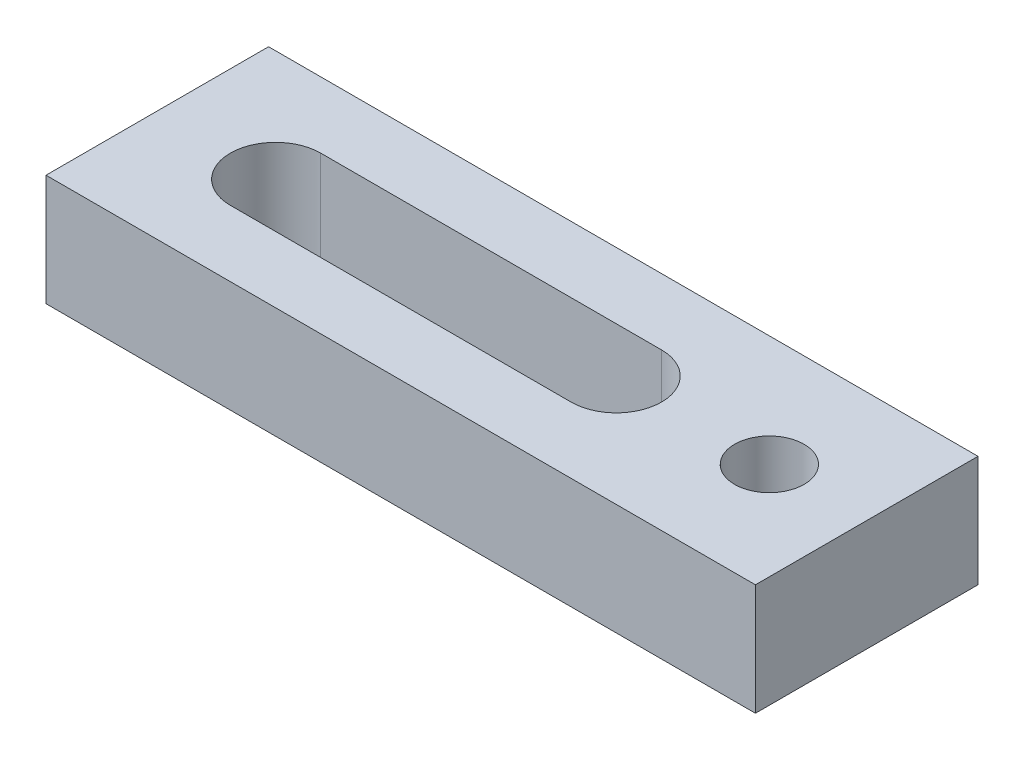
ISO-10303-21;
HEADER;
FILE_DESCRIPTION(('STEP AP214'),'2;1');
FILE_NAME('part.step','',(''),(''),'','','');
FILE_SCHEMA(('AUTOMOTIVE_DESIGN { 1 0 10303 214 1 1 1 1 }'));
ENDSEC;
DATA;
#1=APPLICATION_CONTEXT('core data for automotive mechanical design processes');
#2=APPLICATION_PROTOCOL_DEFINITION('international standard','automotive_design',2000,#1);
#3=PRODUCT_CONTEXT('',#1,'mechanical');
#4=PRODUCT('Part','Part','',(#3));
#5=PRODUCT_RELATED_PRODUCT_CATEGORY('part','',(#4));
#6=PRODUCT_DEFINITION_FORMATION('','',#4);
#7=PRODUCT_DEFINITION_CONTEXT('part definition',#1,'design');
#8=PRODUCT_DEFINITION('design','',#6,#7);
#9=PRODUCT_DEFINITION_SHAPE('','',#8);
#10=(LENGTH_UNIT() NAMED_UNIT(*) SI_UNIT(.MILLI.,.METRE.));
#11=(NAMED_UNIT(*) PLANE_ANGLE_UNIT() SI_UNIT($,.RADIAN.));
#12=(NAMED_UNIT(*) SI_UNIT($,.STERADIAN.) SOLID_ANGLE_UNIT());
#13=UNCERTAINTY_MEASURE_WITH_UNIT(LENGTH_MEASURE(1.E-05),#10,'distance_accuracy_value','');
#14=(GEOMETRIC_REPRESENTATION_CONTEXT(3) GLOBAL_UNCERTAINTY_ASSIGNED_CONTEXT((#13)) GLOBAL_UNIT_ASSIGNED_CONTEXT((#10,
#11,#12)) REPRESENTATION_CONTEXT('',''));
#15=CARTESIAN_POINT('',(0.,0.,0.));
#16=DIRECTION('',(0.,0.,1.));
#17=DIRECTION('',(1.,0.,0.));
#18=AXIS2_PLACEMENT_3D('',#15,#16,#17);
#19=CARTESIAN_POINT('',(0.,8.,0.));
#20=DIRECTION('',(-1.,0.,0.));
#21=DIRECTION('',(0.,0.,1.));
#22=AXIS2_PLACEMENT_3D('',#19,#20,#21);
#23=PLANE('',#22);
#24=DIRECTION('',(0.,0.,-1.));
#25=VECTOR('',#24,1.);
#26=CARTESIAN_POINT('',(0.,0.,0.));
#27=LINE('',#26,#25);
#28=CARTESIAN_POINT('',(0.,0.,0.));
#29=VERTEX_POINT('',#28);
#30=CARTESIAN_POINT('',(0.,0.,-16.));
#31=VERTEX_POINT('',#30);
#32=EDGE_CURVE('E149',#29,#31,#27,.T.);
#33=ORIENTED_EDGE('',*,*,#32,.F.);
#34=DIRECTION('',(0.,-1.,0.));
#35=VECTOR('',#34,1.);
#36=CARTESIAN_POINT('',(0.,8.,0.));
#37=LINE('',#36,#35);
#38=CARTESIAN_POINT('',(0.,8.,0.));
#39=VERTEX_POINT('',#38);
#40=EDGE_CURVE('E13',#39,#29,#37,.T.);
#41=ORIENTED_EDGE('',*,*,#40,.F.);
#42=DIRECTION('',(0.,0.,-1.));
#43=VECTOR('',#42,1.);
#44=CARTESIAN_POINT('',(0.,8.,0.));
#45=LINE('',#44,#43);
#46=CARTESIAN_POINT('',(0.,8.,-16.));
#47=VERTEX_POINT('',#46);
#48=EDGE_CURVE('E153',#39,#47,#45,.T.);
#49=ORIENTED_EDGE('',*,*,#48,.T.);
#50=DIRECTION('',(0.,-1.,0.));
#51=VECTOR('',#50,1.);
#52=CARTESIAN_POINT('',(0.,8.,-16.));
#53=LINE('',#52,#51);
#54=EDGE_CURVE('E50',#47,#31,#53,.T.);
#55=ORIENTED_EDGE('',*,*,#54,.T.);
#56=EDGE_LOOP('',(#33,#41,#49,#55));
#57=FACE_BOUND('',#56,.T.);
#58=ADVANCED_FACE('F47',(#57),#23,.T.);
#59=CARTESIAN_POINT('',(0.,8.,0.));
#60=DIRECTION('',(0.,0.,-1.));
#61=DIRECTION('',(-1.,0.,0.));
#62=AXIS2_PLACEMENT_3D('',#59,#60,#61);
#63=PLANE('',#62);
#64=DIRECTION('',(1.,0.,0.));
#65=VECTOR('',#64,1.);
#66=CARTESIAN_POINT('',(0.,0.,0.));
#67=LINE('',#66,#65);
#68=CARTESIAN_POINT('',(51.,0.,0.));
#69=VERTEX_POINT('',#68);
#70=EDGE_CURVE('E157',#29,#69,#67,.T.);
#71=ORIENTED_EDGE('',*,*,#70,.T.);
#72=DIRECTION('',(0.,-1.,0.));
#73=VECTOR('',#72,1.);
#74=CARTESIAN_POINT('',(51.,8.,0.));
#75=LINE('',#74,#73);
#76=CARTESIAN_POINT('',(51.,8.,0.));
#77=VERTEX_POINT('',#76);
#78=EDGE_CURVE('E55',#77,#69,#75,.T.);
#79=ORIENTED_EDGE('',*,*,#78,.F.);
#80=DIRECTION('',(1.,0.,0.));
#81=VECTOR('',#80,1.);
#82=CARTESIAN_POINT('',(0.,8.,0.));
#83=LINE('',#82,#81);
#84=EDGE_CURVE('E162',#39,#77,#83,.T.);
#85=ORIENTED_EDGE('',*,*,#84,.F.);
#86=ORIENTED_EDGE('',*,*,#40,.T.);
#87=EDGE_LOOP('',(#71,#79,#85,#86));
#88=FACE_BOUND('',#87,.T.);
#89=ADVANCED_FACE('F187',(#88),#63,.F.);
#90=CARTESIAN_POINT('',(51.,8.,0.));
#91=DIRECTION('',(-1.,0.,0.));
#92=DIRECTION('',(0.,0.,1.));
#93=AXIS2_PLACEMENT_3D('',#90,#91,#92);
#94=PLANE('',#93);
#95=DIRECTION('',(0.,0.,-1.));
#96=VECTOR('',#95,1.);
#97=CARTESIAN_POINT('',(51.,0.,0.));
#98=LINE('',#97,#96);
#99=CARTESIAN_POINT('',(51.,0.,-16.));
#100=VERTEX_POINT('',#99);
#101=EDGE_CURVE('E169',#69,#100,#98,.T.);
#102=ORIENTED_EDGE('',*,*,#101,.T.);
#103=DIRECTION('',(0.,-1.,0.));
#104=VECTOR('',#103,1.);
#105=CARTESIAN_POINT('',(51.,8.,-16.));
#106=LINE('',#105,#104);
#107=CARTESIAN_POINT('',(51.,8.,-16.));
#108=VERTEX_POINT('',#107);
#109=EDGE_CURVE('E174',#108,#100,#106,.T.);
#110=ORIENTED_EDGE('',*,*,#109,.F.);
#111=DIRECTION('',(0.,0.,-1.));
#112=VECTOR('',#111,1.);
#113=CARTESIAN_POINT('',(51.,8.,0.));
#114=LINE('',#113,#112);
#115=EDGE_CURVE('E160',#77,#108,#114,.T.);
#116=ORIENTED_EDGE('',*,*,#115,.F.);
#117=ORIENTED_EDGE('',*,*,#78,.T.);
#118=EDGE_LOOP('',(#102,#110,#116,#117));
#119=FACE_BOUND('',#118,.T.);
#120=ADVANCED_FACE('F191',(#119),#94,.F.);
#121=CARTESIAN_POINT('',(0.,8.,-16.));
#122=DIRECTION('',(0.,0.,-1.));
#123=DIRECTION('',(-1.,0.,0.));
#124=AXIS2_PLACEMENT_3D('',#121,#122,#123);
#125=PLANE('',#124);
#126=DIRECTION('',(1.,0.,0.));
#127=VECTOR('',#126,1.);
#128=CARTESIAN_POINT('',(0.,0.,-16.));
#129=LINE('',#128,#127);
#130=EDGE_CURVE('E166',#31,#100,#129,.T.);
#131=ORIENTED_EDGE('',*,*,#130,.F.);
#132=ORIENTED_EDGE('',*,*,#54,.F.);
#133=DIRECTION('',(1.,0.,0.));
#134=VECTOR('',#133,1.);
#135=CARTESIAN_POINT('',(0.,8.,-16.));
#136=LINE('',#135,#134);
#137=EDGE_CURVE('E156',#47,#108,#136,.T.);
#138=ORIENTED_EDGE('',*,*,#137,.T.);
#139=ORIENTED_EDGE('',*,*,#109,.T.);
#140=EDGE_LOOP('',(#131,#132,#138,#139));
#141=FACE_BOUND('',#140,.T.);
#142=ADVANCED_FACE('F182',(#141),#125,.T.);
#143=CARTESIAN_POINT('',(0.,8.,0.));
#144=DIRECTION('',(0.,-1.,0.));
#145=DIRECTION('',(0.,0.,-1.));
#146=AXIS2_PLACEMENT_3D('',#143,#144,#145);
#147=PLANE('',#146);
#148=CARTESIAN_POINT('',(44.,8.,-8.));
#149=DIRECTION('',(0.,1.,0.));
#150=DIRECTION('',(0.,0.,1.));
#151=AXIS2_PLACEMENT_3D('',#148,#149,#150);
#152=CIRCLE('',#151,2.5);
#153=CARTESIAN_POINT('',(44.,8.,-5.5));
#154=VERTEX_POINT('',#153);
#155=EDGE_CURVE('E136',#154,#154,#152,.T.);
#156=ORIENTED_EDGE('',*,*,#155,.F.);
#157=EDGE_LOOP('',(#156));
#158=FACE_BOUND('',#157,.T.);
#159=DIRECTION('',(1.,0.,0.));
#160=VECTOR('',#159,1.);
#161=CARTESIAN_POINT('',(8.5,8.,-4.75));
#162=LINE('',#161,#160);
#163=CARTESIAN_POINT('',(8.5,8.,-4.75));
#164=VERTEX_POINT('',#163);
#165=CARTESIAN_POINT('',(33.,8.,-4.75));
#166=VERTEX_POINT('',#165);
#167=EDGE_CURVE('E142',#164,#166,#162,.T.);
#168=ORIENTED_EDGE('',*,*,#167,.F.);
#169=CARTESIAN_POINT('',(8.5,8.,-8.));
#170=DIRECTION('',(0.,1.,0.));
#171=DIRECTION('',(0.,0.,1.));
#172=AXIS2_PLACEMENT_3D('',#169,#170,#171);
#173=CIRCLE('',#172,3.25);
#174=CARTESIAN_POINT('',(8.5,8.,-11.25));
#175=VERTEX_POINT('',#174);
#176=EDGE_CURVE('E63',#175,#164,#173,.T.);
#177=ORIENTED_EDGE('',*,*,#176,.F.);
#178=DIRECTION('',(1.,0.,0.));
#179=VECTOR('',#178,1.);
#180=CARTESIAN_POINT('',(8.5,8.,-11.25));
#181=LINE('',#180,#179);
#182=CARTESIAN_POINT('',(33.,8.,-11.25));
#183=VERTEX_POINT('',#182);
#184=EDGE_CURVE('E130',#175,#183,#181,.T.);
#185=ORIENTED_EDGE('',*,*,#184,.T.);
#186=CARTESIAN_POINT('',(33.,8.,-8.));
#187=DIRECTION('',(0.,1.,0.));
#188=DIRECTION('',(0.,0.,1.));
#189=AXIS2_PLACEMENT_3D('',#186,#187,#188);
#190=CIRCLE('',#189,3.25);
#191=EDGE_CURVE('E133',#166,#183,#190,.T.);
#192=ORIENTED_EDGE('',*,*,#191,.F.);
#193=EDGE_LOOP('',(#168,#177,#185,#192));
#194=FACE_BOUND('',#193,.T.);
#195=ORIENTED_EDGE('',*,*,#48,.F.);
#196=ORIENTED_EDGE('',*,*,#84,.T.);
#197=ORIENTED_EDGE('',*,*,#115,.T.);
#198=ORIENTED_EDGE('',*,*,#137,.F.);
#199=EDGE_LOOP('',(#195,#196,#197,#198));
#200=FACE_BOUND('',#199,.T.);
#201=ADVANCED_FACE('F193',(#158,#194,#200),#147,.F.);
#202=CARTESIAN_POINT('',(0.,0.,0.));
#203=DIRECTION('',(0.,-1.,0.));
#204=DIRECTION('',(0.,0.,-1.));
#205=AXIS2_PLACEMENT_3D('',#202,#203,#204);
#206=PLANE('',#205);
#207=CARTESIAN_POINT('',(44.,0.,-8.));
#208=DIRECTION('',(0.,1.,0.));
#209=DIRECTION('',(0.,0.,1.));
#210=AXIS2_PLACEMENT_3D('',#207,#208,#209);
#211=CIRCLE('',#210,2.5);
#212=CARTESIAN_POINT('',(44.,0.,-5.5));
#213=VERTEX_POINT('',#212);
#214=EDGE_CURVE('E143',#213,#213,#211,.T.);
#215=ORIENTED_EDGE('',*,*,#214,.T.);
#216=EDGE_LOOP('',(#215));
#217=FACE_BOUND('',#216,.T.);
#218=CARTESIAN_POINT('',(8.5,0.,-8.));
#219=DIRECTION('',(0.,1.,0.));
#220=DIRECTION('',(0.,0.,1.));
#221=AXIS2_PLACEMENT_3D('',#218,#219,#220);
#222=CIRCLE('',#221,3.25);
#223=CARTESIAN_POINT('',(8.5,0.,-11.25));
#224=VERTEX_POINT('',#223);
#225=CARTESIAN_POINT('',(8.5,0.,-4.75));
#226=VERTEX_POINT('',#225);
#227=EDGE_CURVE('E115',#224,#226,#222,.T.);
#228=ORIENTED_EDGE('',*,*,#227,.T.);
#229=DIRECTION('',(1.,0.,0.));
#230=VECTOR('',#229,1.);
#231=CARTESIAN_POINT('',(8.5,0.,-4.75));
#232=LINE('',#231,#230);
#233=CARTESIAN_POINT('',(33.,0.,-4.75));
#234=VERTEX_POINT('',#233);
#235=EDGE_CURVE('E124',#226,#234,#232,.T.);
#236=ORIENTED_EDGE('',*,*,#235,.T.);
#237=CARTESIAN_POINT('',(33.,0.,-8.));
#238=DIRECTION('',(0.,1.,0.));
#239=DIRECTION('',(0.,0.,1.));
#240=AXIS2_PLACEMENT_3D('',#237,#238,#239);
#241=CIRCLE('',#240,3.25);
#242=CARTESIAN_POINT('',(33.,0.,-11.25));
#243=VERTEX_POINT('',#242);
#244=EDGE_CURVE('E71',#234,#243,#241,.T.);
#245=ORIENTED_EDGE('',*,*,#244,.T.);
#246=DIRECTION('',(1.,0.,0.));
#247=VECTOR('',#246,1.);
#248=CARTESIAN_POINT('',(8.5,0.,-11.25));
#249=LINE('',#248,#247);
#250=EDGE_CURVE('E121',#224,#243,#249,.T.);
#251=ORIENTED_EDGE('',*,*,#250,.F.);
#252=EDGE_LOOP('',(#228,#236,#245,#251));
#253=FACE_BOUND('',#252,.T.);
#254=ORIENTED_EDGE('',*,*,#32,.T.);
#255=ORIENTED_EDGE('',*,*,#130,.T.);
#256=ORIENTED_EDGE('',*,*,#101,.F.);
#257=ORIENTED_EDGE('',*,*,#70,.F.);
#258=EDGE_LOOP('',(#254,#255,#256,#257));
#259=FACE_BOUND('',#258,.T.);
#260=ADVANCED_FACE('F128',(#217,#253,#259),#206,.T.);
#261=CARTESIAN_POINT('',(8.5,0.,-8.));
#262=DIRECTION('',(0.,1.,0.));
#263=DIRECTION('',(0.,0.,1.));
#264=AXIS2_PLACEMENT_3D('',#261,#262,#263);
#265=CYLINDRICAL_SURFACE('',#264,3.25);
#266=ORIENTED_EDGE('',*,*,#176,.T.);
#267=DIRECTION('',(0.,1.,0.));
#268=VECTOR('',#267,1.);
#269=CARTESIAN_POINT('',(8.5,0.,-4.75));
#270=LINE('',#269,#268);
#271=EDGE_CURVE('E111',#226,#164,#270,.T.);
#272=ORIENTED_EDGE('',*,*,#271,.F.);
#273=ORIENTED_EDGE('',*,*,#227,.F.);
#274=DIRECTION('',(0.,1.,0.));
#275=VECTOR('',#274,1.);
#276=CARTESIAN_POINT('',(8.5,0.,-11.25));
#277=LINE('',#276,#275);
#278=EDGE_CURVE('E147',#224,#175,#277,.T.);
#279=ORIENTED_EDGE('',*,*,#278,.T.);
#280=EDGE_LOOP('',(#266,#272,#273,#279));
#281=FACE_BOUND('',#280,.T.);
#282=ADVANCED_FACE('F113',(#281),#265,.F.);
#283=CARTESIAN_POINT('',(8.5,0.,-11.25));
#284=DIRECTION('',(0.,0.,1.));
#285=DIRECTION('',(1.,0.,0.));
#286=AXIS2_PLACEMENT_3D('',#283,#284,#285);
#287=PLANE('',#286);
#288=ORIENTED_EDGE('',*,*,#184,.F.);
#289=ORIENTED_EDGE('',*,*,#278,.F.);
#290=ORIENTED_EDGE('',*,*,#250,.T.);
#291=DIRECTION('',(0.,1.,0.));
#292=VECTOR('',#291,1.);
#293=CARTESIAN_POINT('',(33.,0.,-11.25));
#294=LINE('',#293,#292);
#295=EDGE_CURVE('E150',#243,#183,#294,.T.);
#296=ORIENTED_EDGE('',*,*,#295,.T.);
#297=EDGE_LOOP('',(#288,#289,#290,#296));
#298=FACE_BOUND('',#297,.T.);
#299=ADVANCED_FACE('F231',(#298),#287,.T.);
#300=CARTESIAN_POINT('',(33.,0.,-8.));
#301=DIRECTION('',(0.,1.,0.));
#302=DIRECTION('',(0.,0.,1.));
#303=AXIS2_PLACEMENT_3D('',#300,#301,#302);
#304=CYLINDRICAL_SURFACE('',#303,3.25);
#305=ORIENTED_EDGE('',*,*,#191,.T.);
#306=ORIENTED_EDGE('',*,*,#295,.F.);
#307=ORIENTED_EDGE('',*,*,#244,.F.);
#308=DIRECTION('',(0.,1.,0.));
#309=VECTOR('',#308,1.);
#310=CARTESIAN_POINT('',(33.,0.,-4.75));
#311=LINE('',#310,#309);
#312=EDGE_CURVE('E120',#234,#166,#311,.T.);
#313=ORIENTED_EDGE('',*,*,#312,.T.);
#314=EDGE_LOOP('',(#305,#306,#307,#313));
#315=FACE_BOUND('',#314,.T.);
#316=ADVANCED_FACE('F240',(#315),#304,.F.);
#317=CARTESIAN_POINT('',(8.5,0.,-4.75));
#318=DIRECTION('',(0.,0.,1.));
#319=DIRECTION('',(1.,0.,0.));
#320=AXIS2_PLACEMENT_3D('',#317,#318,#319);
#321=PLANE('',#320);
#322=ORIENTED_EDGE('',*,*,#167,.T.);
#323=ORIENTED_EDGE('',*,*,#312,.F.);
#324=ORIENTED_EDGE('',*,*,#235,.F.);
#325=ORIENTED_EDGE('',*,*,#271,.T.);
#326=EDGE_LOOP('',(#322,#323,#324,#325));
#327=FACE_BOUND('',#326,.T.);
#328=ADVANCED_FACE('F125',(#327),#321,.F.);
#329=CARTESIAN_POINT('',(44.,0.,-8.));
#330=DIRECTION('',(0.,1.,0.));
#331=DIRECTION('',(0.,0.,1.));
#332=AXIS2_PLACEMENT_3D('',#329,#330,#331);
#333=CYLINDRICAL_SURFACE('',#332,2.5);
#334=ORIENTED_EDGE('',*,*,#214,.F.);
#335=EDGE_LOOP('',(#334));
#336=FACE_BOUND('',#335,.T.);
#337=ORIENTED_EDGE('',*,*,#155,.T.);
#338=EDGE_LOOP('',(#337));
#339=FACE_BOUND('',#338,.T.);
#340=ADVANCED_FACE('F257',(#336,#339),#333,.F.);
#341=CLOSED_SHELL('',(#58,#89,#120,#142,#201,#260,#282,#299,#316,#328,#340));
#342=MANIFOLD_SOLID_BREP('B2',#341);
#343=ADVANCED_BREP_SHAPE_REPRESENTATION('',(#18,#342),#14);
#344=SHAPE_DEFINITION_REPRESENTATION(#9,#343);
ENDSEC;
END-ISO-10303-21;
